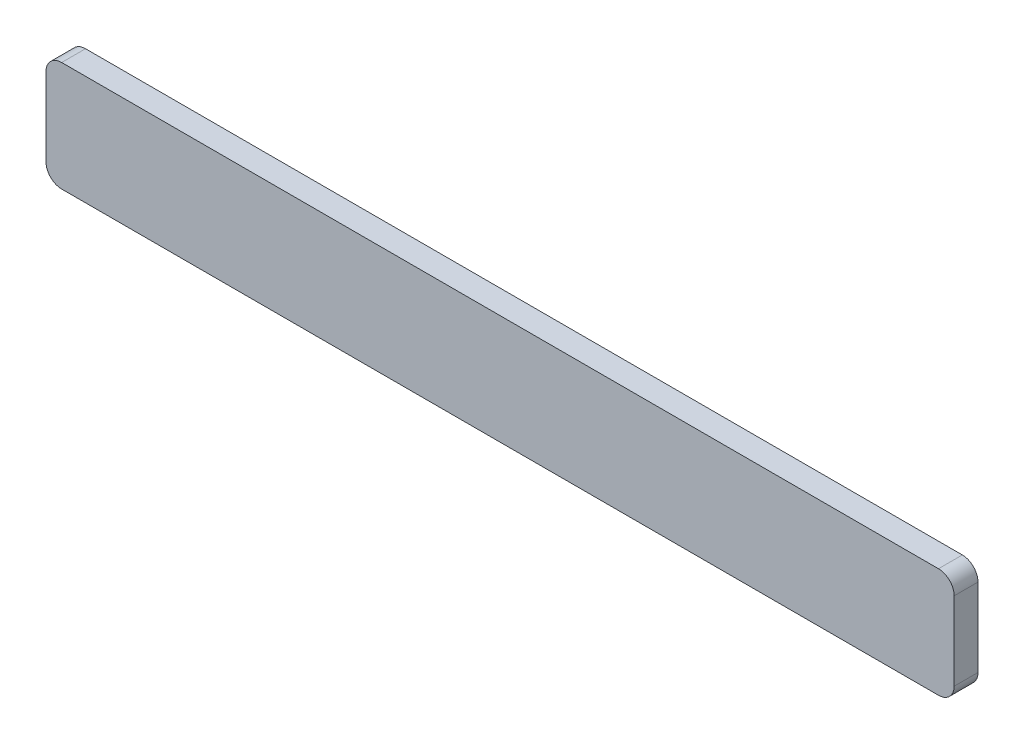
ISO-10303-21;
HEADER;
FILE_DESCRIPTION(('STEP AP214'),'2;1');
FILE_NAME('part.step','',(''),(''),'','','');
FILE_SCHEMA(('AUTOMOTIVE_DESIGN { 1 0 10303 214 1 1 1 1 }'));
ENDSEC;
DATA;
#1=APPLICATION_CONTEXT('core data for automotive mechanical design processes');
#2=APPLICATION_PROTOCOL_DEFINITION('international standard','automotive_design',2000,#1);
#3=PRODUCT_CONTEXT('',#1,'mechanical');
#4=PRODUCT('Part','Part','',(#3));
#5=PRODUCT_RELATED_PRODUCT_CATEGORY('part','',(#4));
#6=PRODUCT_DEFINITION_FORMATION('','',#4);
#7=PRODUCT_DEFINITION_CONTEXT('part definition',#1,'design');
#8=PRODUCT_DEFINITION('design','',#6,#7);
#9=PRODUCT_DEFINITION_SHAPE('','',#8);
#10=(LENGTH_UNIT() NAMED_UNIT(*) SI_UNIT(.MILLI.,.METRE.));
#11=(NAMED_UNIT(*) PLANE_ANGLE_UNIT() SI_UNIT($,.RADIAN.));
#12=(NAMED_UNIT(*) SI_UNIT($,.STERADIAN.) SOLID_ANGLE_UNIT());
#13=UNCERTAINTY_MEASURE_WITH_UNIT(LENGTH_MEASURE(1.E-05),#10,'distance_accuracy_value','');
#14=(GEOMETRIC_REPRESENTATION_CONTEXT(3) GLOBAL_UNCERTAINTY_ASSIGNED_CONTEXT((#13)) GLOBAL_UNIT_ASSIGNED_CONTEXT((#10,
#11,#12)) REPRESENTATION_CONTEXT('',''));
#15=CARTESIAN_POINT('',(0.,0.,0.));
#16=DIRECTION('',(0.,0.,1.));
#17=DIRECTION('',(1.,0.,0.));
#18=AXIS2_PLACEMENT_3D('',#15,#16,#17);
#19=CARTESIAN_POINT('',(29.,3.5,1.524));
#20=DIRECTION('',(-1.,0.,0.));
#21=DIRECTION('',(0.,0.,1.));
#22=AXIS2_PLACEMENT_3D('',#19,#20,#21);
#23=PLANE('',#22);
#24=DIRECTION('',(0.,1.,0.));
#25=VECTOR('',#24,1.);
#26=CARTESIAN_POINT('',(29.,3.5,1.524));
#27=LINE('',#26,#25);
#28=CARTESIAN_POINT('',(29.,-2.5,1.524));
#29=VERTEX_POINT('',#28);
#30=CARTESIAN_POINT('',(29.,2.5,1.524));
#31=VERTEX_POINT('',#30);
#32=EDGE_CURVE('E117',#29,#31,#27,.T.);
#33=ORIENTED_EDGE('',*,*,#32,.F.);
#34=DIRECTION('',(0.,0.,-1.));
#35=VECTOR('',#34,1.);
#36=CARTESIAN_POINT('',(29.,-2.5,1.524));
#37=LINE('',#36,#35);
#38=CARTESIAN_POINT('',(29.,-2.5,0.));
#39=VERTEX_POINT('',#38);
#40=EDGE_CURVE('E102',#29,#39,#37,.T.);
#41=ORIENTED_EDGE('',*,*,#40,.T.);
#42=DIRECTION('',(0.,1.,0.));
#43=VECTOR('',#42,1.);
#44=CARTESIAN_POINT('',(29.,3.5,0.));
#45=LINE('',#44,#43);
#46=CARTESIAN_POINT('',(29.,2.5,0.));
#47=VERTEX_POINT('',#46);
#48=EDGE_CURVE('E114',#39,#47,#45,.T.);
#49=ORIENTED_EDGE('',*,*,#48,.T.);
#50=DIRECTION('',(0.,0.,-1.));
#51=VECTOR('',#50,1.);
#52=CARTESIAN_POINT('',(29.,2.5,1.524));
#53=LINE('',#52,#51);
#54=EDGE_CURVE('E119',#47,#31,#53,.F.);
#55=ORIENTED_EDGE('',*,*,#54,.T.);
#56=EDGE_LOOP('',(#33,#41,#49,#55));
#57=FACE_BOUND('',#56,.T.);
#58=ADVANCED_FACE('F33',(#57),#23,.F.);
#59=CARTESIAN_POINT('',(-29.,3.5,1.524));
#60=DIRECTION('',(0.,-1.,0.));
#61=DIRECTION('',(0.,0.,-1.));
#62=AXIS2_PLACEMENT_3D('',#59,#60,#61);
#63=PLANE('',#62);
#64=DIRECTION('',(-1.,0.,0.));
#65=VECTOR('',#64,1.);
#66=CARTESIAN_POINT('',(-29.,3.5,1.524));
#67=LINE('',#66,#65);
#68=CARTESIAN_POINT('',(28.,3.5,1.524));
#69=VERTEX_POINT('',#68);
#70=CARTESIAN_POINT('',(-28.,3.5,1.524));
#71=VERTEX_POINT('',#70);
#72=EDGE_CURVE('E168',#69,#71,#67,.T.);
#73=ORIENTED_EDGE('',*,*,#72,.F.);
#74=DIRECTION('',(0.,0.,-1.));
#75=VECTOR('',#74,1.);
#76=CARTESIAN_POINT('',(28.,3.5,1.524));
#77=LINE('',#76,#75);
#78=CARTESIAN_POINT('',(28.,3.5,0.));
#79=VERTEX_POINT('',#78);
#80=EDGE_CURVE('E152',#69,#79,#77,.T.);
#81=ORIENTED_EDGE('',*,*,#80,.T.);
#82=DIRECTION('',(-1.,0.,0.));
#83=VECTOR('',#82,1.);
#84=CARTESIAN_POINT('',(-29.,3.5,0.));
#85=LINE('',#84,#83);
#86=CARTESIAN_POINT('',(-28.,3.5,0.));
#87=VERTEX_POINT('',#86);
#88=EDGE_CURVE('E123',#79,#87,#85,.T.);
#89=ORIENTED_EDGE('',*,*,#88,.T.);
#90=DIRECTION('',(0.,0.,-1.));
#91=VECTOR('',#90,1.);
#92=CARTESIAN_POINT('',(-28.,3.5,1.524));
#93=LINE('',#92,#91);
#94=EDGE_CURVE('E150',#87,#71,#93,.F.);
#95=ORIENTED_EDGE('',*,*,#94,.T.);
#96=EDGE_LOOP('',(#73,#81,#89,#95));
#97=FACE_BOUND('',#96,.T.);
#98=ADVANCED_FACE('F178',(#97),#63,.F.);
#99=CARTESIAN_POINT('',(-29.,3.5,1.524));
#100=DIRECTION('',(1.,0.,0.));
#101=DIRECTION('',(0.,0.,-1.));
#102=AXIS2_PLACEMENT_3D('',#99,#100,#101);
#103=PLANE('',#102);
#104=DIRECTION('',(0.,-1.,0.));
#105=VECTOR('',#104,1.);
#106=CARTESIAN_POINT('',(-29.,3.5,0.));
#107=LINE('',#106,#105);
#108=CARTESIAN_POINT('',(-29.,2.5,0.));
#109=VERTEX_POINT('',#108);
#110=CARTESIAN_POINT('',(-29.,-2.5,0.));
#111=VERTEX_POINT('',#110);
#112=EDGE_CURVE('E126',#109,#111,#107,.T.);
#113=ORIENTED_EDGE('',*,*,#112,.T.);
#114=DIRECTION('',(0.,0.,-1.));
#115=VECTOR('',#114,1.);
#116=CARTESIAN_POINT('',(-29.,-2.5,1.524));
#117=LINE('',#116,#115);
#118=CARTESIAN_POINT('',(-29.,-2.5,1.524));
#119=VERTEX_POINT('',#118);
#120=EDGE_CURVE('E11',#111,#119,#117,.F.);
#121=ORIENTED_EDGE('',*,*,#120,.T.);
#122=DIRECTION('',(0.,-1.,0.));
#123=VECTOR('',#122,1.);
#124=CARTESIAN_POINT('',(-29.,3.5,1.524));
#125=LINE('',#124,#123);
#126=CARTESIAN_POINT('',(-29.,2.5,1.524));
#127=VERTEX_POINT('',#126);
#128=EDGE_CURVE('E158',#127,#119,#125,.T.);
#129=ORIENTED_EDGE('',*,*,#128,.F.);
#130=DIRECTION('',(0.,0.,-1.));
#131=VECTOR('',#130,1.);
#132=CARTESIAN_POINT('',(-29.,2.5,1.524));
#133=LINE('',#132,#131);
#134=EDGE_CURVE('E41',#127,#109,#133,.T.);
#135=ORIENTED_EDGE('',*,*,#134,.T.);
#136=EDGE_LOOP('',(#113,#121,#129,#135));
#137=FACE_BOUND('',#136,.T.);
#138=ADVANCED_FACE('F157',(#137),#103,.F.);
#139=CARTESIAN_POINT('',(-29.,-3.5,1.524));
#140=DIRECTION('',(0.,1.,0.));
#141=DIRECTION('',(0.,0.,1.));
#142=AXIS2_PLACEMENT_3D('',#139,#140,#141);
#143=PLANE('',#142);
#144=DIRECTION('',(1.,0.,0.));
#145=VECTOR('',#144,1.);
#146=CARTESIAN_POINT('',(-29.,-3.5,0.));
#147=LINE('',#146,#145);
#148=CARTESIAN_POINT('',(-28.,-3.5,0.));
#149=VERTEX_POINT('',#148);
#150=CARTESIAN_POINT('',(28.,-3.5,0.));
#151=VERTEX_POINT('',#150);
#152=EDGE_CURVE('E133',#149,#151,#147,.T.);
#153=ORIENTED_EDGE('',*,*,#152,.T.);
#154=DIRECTION('',(0.,0.,-1.));
#155=VECTOR('',#154,1.);
#156=CARTESIAN_POINT('',(28.,-3.5,1.524));
#157=LINE('',#156,#155);
#158=CARTESIAN_POINT('',(28.,-3.5,1.524));
#159=VERTEX_POINT('',#158);
#160=EDGE_CURVE('E103',#151,#159,#157,.F.);
#161=ORIENTED_EDGE('',*,*,#160,.T.);
#162=DIRECTION('',(1.,0.,0.));
#163=VECTOR('',#162,1.);
#164=CARTESIAN_POINT('',(-29.,-3.5,1.524));
#165=LINE('',#164,#163);
#166=CARTESIAN_POINT('',(-28.,-3.5,1.524));
#167=VERTEX_POINT('',#166);
#168=EDGE_CURVE('E129',#167,#159,#165,.T.);
#169=ORIENTED_EDGE('',*,*,#168,.F.);
#170=DIRECTION('',(0.,0.,-1.));
#171=VECTOR('',#170,1.);
#172=CARTESIAN_POINT('',(-28.,-3.5,1.524));
#173=LINE('',#172,#171);
#174=EDGE_CURVE('E108',#167,#149,#173,.T.);
#175=ORIENTED_EDGE('',*,*,#174,.T.);
#176=EDGE_LOOP('',(#153,#161,#169,#175));
#177=FACE_BOUND('',#176,.T.);
#178=ADVANCED_FACE('F166',(#177),#143,.F.);
#179=CARTESIAN_POINT('',(0.,0.,1.524));
#180=DIRECTION('',(0.,0.,1.));
#181=DIRECTION('',(1.,0.,0.));
#182=AXIS2_PLACEMENT_3D('',#179,#180,#181);
#183=PLANE('',#182);
#184=ORIENTED_EDGE('',*,*,#168,.T.);
#185=CARTESIAN_POINT('',(28.,-2.5,1.524));
#186=DIRECTION('',(0.,0.,1.));
#187=DIRECTION('',(1.,0.,0.));
#188=AXIS2_PLACEMENT_3D('',#185,#186,#187);
#189=CIRCLE('',#188,1.);
#190=EDGE_CURVE('E148',#159,#29,#189,.T.);
#191=ORIENTED_EDGE('',*,*,#190,.T.);
#192=ORIENTED_EDGE('',*,*,#32,.T.);
#193=CARTESIAN_POINT('',(28.,2.5,1.524));
#194=DIRECTION('',(0.,0.,1.));
#195=DIRECTION('',(1.,0.,0.));
#196=AXIS2_PLACEMENT_3D('',#193,#194,#195);
#197=CIRCLE('',#196,1.);
#198=EDGE_CURVE('E146',#31,#69,#197,.T.);
#199=ORIENTED_EDGE('',*,*,#198,.T.);
#200=ORIENTED_EDGE('',*,*,#72,.T.);
#201=CARTESIAN_POINT('',(-28.,2.5,1.524));
#202=DIRECTION('',(0.,0.,1.));
#203=DIRECTION('',(1.,0.,0.));
#204=AXIS2_PLACEMENT_3D('',#201,#202,#203);
#205=CIRCLE('',#204,1.);
#206=EDGE_CURVE('E53',#71,#127,#205,.T.);
#207=ORIENTED_EDGE('',*,*,#206,.T.);
#208=ORIENTED_EDGE('',*,*,#128,.T.);
#209=CARTESIAN_POINT('',(-28.,-2.5,1.524));
#210=DIRECTION('',(0.,0.,1.));
#211=DIRECTION('',(1.,0.,0.));
#212=AXIS2_PLACEMENT_3D('',#209,#210,#211);
#213=CIRCLE('',#212,1.);
#214=EDGE_CURVE('E144',#119,#167,#213,.T.);
#215=ORIENTED_EDGE('',*,*,#214,.T.);
#216=EDGE_LOOP('',(#184,#191,#192,#199,#200,#207,#208,#215));
#217=FACE_BOUND('',#216,.T.);
#218=ADVANCED_FACE('F172',(#217),#183,.T.);
#219=CARTESIAN_POINT('',(0.,0.,0.));
#220=DIRECTION('',(0.,0.,1.));
#221=DIRECTION('',(1.,0.,0.));
#222=AXIS2_PLACEMENT_3D('',#219,#220,#221);
#223=PLANE('',#222);
#224=ORIENTED_EDGE('',*,*,#48,.F.);
#225=CARTESIAN_POINT('',(28.,-2.5,0.));
#226=DIRECTION('',(0.,0.,1.));
#227=DIRECTION('',(1.,0.,0.));
#228=AXIS2_PLACEMENT_3D('',#225,#226,#227);
#229=CIRCLE('',#228,1.);
#230=EDGE_CURVE('E98',#39,#151,#229,.F.);
#231=ORIENTED_EDGE('',*,*,#230,.T.);
#232=ORIENTED_EDGE('',*,*,#152,.F.);
#233=CARTESIAN_POINT('',(-28.,-2.5,0.));
#234=DIRECTION('',(0.,0.,1.));
#235=DIRECTION('',(1.,0.,0.));
#236=AXIS2_PLACEMENT_3D('',#233,#234,#235);
#237=CIRCLE('',#236,1.);
#238=EDGE_CURVE('E137',#149,#111,#237,.F.);
#239=ORIENTED_EDGE('',*,*,#238,.T.);
#240=ORIENTED_EDGE('',*,*,#112,.F.);
#241=CARTESIAN_POINT('',(-28.,2.5,0.));
#242=DIRECTION('',(0.,0.,1.));
#243=DIRECTION('',(1.,0.,0.));
#244=AXIS2_PLACEMENT_3D('',#241,#242,#243);
#245=CIRCLE('',#244,1.);
#246=EDGE_CURVE('E118',#109,#87,#245,.F.);
#247=ORIENTED_EDGE('',*,*,#246,.T.);
#248=ORIENTED_EDGE('',*,*,#88,.F.);
#249=CARTESIAN_POINT('',(28.,2.5,0.));
#250=DIRECTION('',(0.,0.,1.));
#251=DIRECTION('',(1.,0.,0.));
#252=AXIS2_PLACEMENT_3D('',#249,#250,#251);
#253=CIRCLE('',#252,1.);
#254=EDGE_CURVE('E109',#79,#47,#253,.F.);
#255=ORIENTED_EDGE('',*,*,#254,.T.);
#256=EDGE_LOOP('',(#224,#231,#232,#239,#240,#247,#248,#255));
#257=FACE_BOUND('',#256,.T.);
#258=ADVANCED_FACE('F121',(#257),#223,.F.);
#259=CARTESIAN_POINT('',(28.,-2.5,1.524));
#260=DIRECTION('',(0.,0.,-1.));
#261=DIRECTION('',(-1.,0.,0.));
#262=AXIS2_PLACEMENT_3D('',#259,#260,#261);
#263=CYLINDRICAL_SURFACE('',#262,1.);
#264=ORIENTED_EDGE('',*,*,#190,.F.);
#265=ORIENTED_EDGE('',*,*,#160,.F.);
#266=ORIENTED_EDGE('',*,*,#230,.F.);
#267=ORIENTED_EDGE('',*,*,#40,.F.);
#268=EDGE_LOOP('',(#264,#265,#266,#267));
#269=FACE_BOUND('',#268,.T.);
#270=ADVANCED_FACE('F101',(#269),#263,.T.);
#271=CARTESIAN_POINT('',(28.,2.5,1.524));
#272=DIRECTION('',(0.,0.,-1.));
#273=DIRECTION('',(-1.,0.,0.));
#274=AXIS2_PLACEMENT_3D('',#271,#272,#273);
#275=CYLINDRICAL_SURFACE('',#274,1.);
#276=ORIENTED_EDGE('',*,*,#198,.F.);
#277=ORIENTED_EDGE('',*,*,#54,.F.);
#278=ORIENTED_EDGE('',*,*,#254,.F.);
#279=ORIENTED_EDGE('',*,*,#80,.F.);
#280=EDGE_LOOP('',(#276,#277,#278,#279));
#281=FACE_BOUND('',#280,.T.);
#282=ADVANCED_FACE('F176',(#281),#275,.T.);
#283=CARTESIAN_POINT('',(-28.,-2.5,1.524));
#284=DIRECTION('',(0.,0.,-1.));
#285=DIRECTION('',(-1.,0.,0.));
#286=AXIS2_PLACEMENT_3D('',#283,#284,#285);
#287=CYLINDRICAL_SURFACE('',#286,1.);
#288=ORIENTED_EDGE('',*,*,#214,.F.);
#289=ORIENTED_EDGE('',*,*,#120,.F.);
#290=ORIENTED_EDGE('',*,*,#238,.F.);
#291=ORIENTED_EDGE('',*,*,#174,.F.);
#292=EDGE_LOOP('',(#288,#289,#290,#291));
#293=FACE_BOUND('',#292,.T.);
#294=ADVANCED_FACE('F163',(#293),#287,.T.);
#295=CARTESIAN_POINT('',(-28.,2.5,1.524));
#296=DIRECTION('',(0.,0.,-1.));
#297=DIRECTION('',(-1.,0.,0.));
#298=AXIS2_PLACEMENT_3D('',#295,#296,#297);
#299=CYLINDRICAL_SURFACE('',#298,1.);
#300=ORIENTED_EDGE('',*,*,#206,.F.);
#301=ORIENTED_EDGE('',*,*,#94,.F.);
#302=ORIENTED_EDGE('',*,*,#246,.F.);
#303=ORIENTED_EDGE('',*,*,#134,.F.);
#304=EDGE_LOOP('',(#300,#301,#302,#303));
#305=FACE_BOUND('',#304,.T.);
#306=ADVANCED_FACE('F35',(#305),#299,.T.);
#307=CLOSED_SHELL('',(#58,#98,#138,#178,#218,#258,#270,#282,#294,#306));
#308=MANIFOLD_SOLID_BREP('B2',#307);
#309=ADVANCED_BREP_SHAPE_REPRESENTATION('',(#18,#308),#14);
#310=SHAPE_DEFINITION_REPRESENTATION(#9,#309);
ENDSEC;
END-ISO-10303-21;
